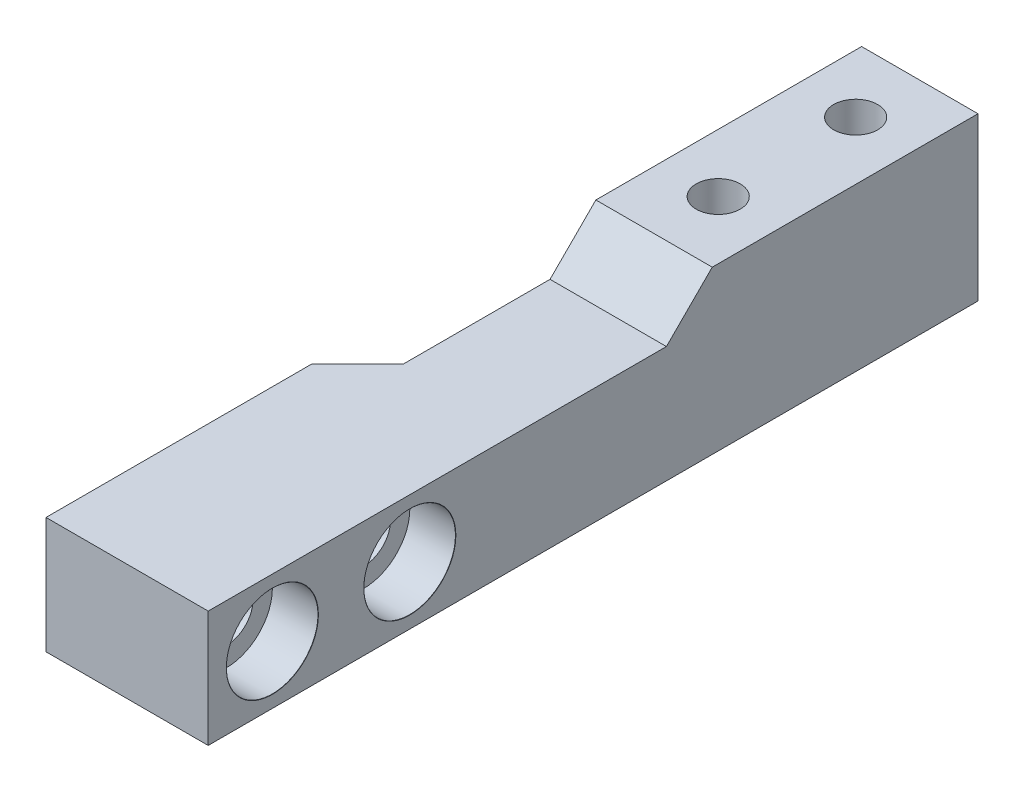
ISO-10303-21;
HEADER;
FILE_DESCRIPTION(('STEP AP214'),'2;1');
FILE_NAME('part.step','',(''),(''),'','','');
FILE_SCHEMA(('AUTOMOTIVE_DESIGN { 1 0 10303 214 1 1 1 1 }'));
ENDSEC;
DATA;
#1=APPLICATION_CONTEXT('core data for automotive mechanical design processes');
#2=APPLICATION_PROTOCOL_DEFINITION('international standard','automotive_design',2000,#1);
#3=PRODUCT_CONTEXT('',#1,'mechanical');
#4=PRODUCT('Part','Part','',(#3));
#5=PRODUCT_RELATED_PRODUCT_CATEGORY('part','',(#4));
#6=PRODUCT_DEFINITION_FORMATION('','',#4);
#7=PRODUCT_DEFINITION_CONTEXT('part definition',#1,'design');
#8=PRODUCT_DEFINITION('design','',#6,#7);
#9=PRODUCT_DEFINITION_SHAPE('','',#8);
#10=(LENGTH_UNIT() NAMED_UNIT(*) SI_UNIT(.MILLI.,.METRE.));
#11=(NAMED_UNIT(*) PLANE_ANGLE_UNIT() SI_UNIT($,.RADIAN.));
#12=(NAMED_UNIT(*) SI_UNIT($,.STERADIAN.) SOLID_ANGLE_UNIT());
#13=UNCERTAINTY_MEASURE_WITH_UNIT(LENGTH_MEASURE(1.E-05),#10,'distance_accuracy_value','');
#14=(GEOMETRIC_REPRESENTATION_CONTEXT(3) GLOBAL_UNCERTAINTY_ASSIGNED_CONTEXT((#13)) GLOBAL_UNIT_ASSIGNED_CONTEXT((#10,
#11,#12)) REPRESENTATION_CONTEXT('',''));
#15=CARTESIAN_POINT('',(0.,0.,0.));
#16=DIRECTION('',(0.,0.,1.));
#17=DIRECTION('',(1.,0.,0.));
#18=AXIS2_PLACEMENT_3D('',#15,#16,#17);
#19=CARTESIAN_POINT('',(-6.35,12.7,42.));
#20=DIRECTION('',(1.,0.,0.));
#21=DIRECTION('',(0.,0.,-1.));
#22=AXIS2_PLACEMENT_3D('',#19,#20,#21);
#23=PLANE('',#22);
#24=DIRECTION('',(0.,0.,1.));
#25=VECTOR('',#24,1.);
#26=CARTESIAN_POINT('',(-6.35,0.,42.));
#27=LINE('',#26,#25);
#28=CARTESIAN_POINT('',(-6.35,0.,-42.));
#29=VERTEX_POINT('',#28);
#30=CARTESIAN_POINT('',(-6.35,0.,8.00000000000004));
#31=VERTEX_POINT('',#30);
#32=EDGE_CURVE('E220',#29,#31,#27,.T.);
#33=ORIENTED_EDGE('',*,*,#32,.T.);
#34=DIRECTION('',(0.,1.,0.));
#35=VECTOR('',#34,1.);
#36=CARTESIAN_POINT('',(-6.35,12.7,8.00000000000004));
#37=LINE('',#36,#35);
#38=CARTESIAN_POINT('',(-6.35,12.7,8.00000000000005));
#39=VERTEX_POINT('',#38);
#40=EDGE_CURVE('E235',#31,#39,#37,.T.);
#41=ORIENTED_EDGE('',*,*,#40,.T.);
#42=DIRECTION('',(0.,0.,1.));
#43=VECTOR('',#42,1.);
#44=CARTESIAN_POINT('',(-6.35,12.7,42.));
#45=LINE('',#44,#43);
#46=CARTESIAN_POINT('',(-6.35,12.7,-7.99999999999999));
#47=VERTEX_POINT('',#46);
#48=EDGE_CURVE('E121',#47,#39,#45,.T.);
#49=ORIENTED_EDGE('',*,*,#48,.F.);
#50=DIRECTION('',(0.,-0.707106781186551,0.707106781186544));
#51=VECTOR('',#50,1.);
#52=CARTESIAN_POINT('',(-6.35,-12.3,16.9999999999997));
#53=LINE('',#52,#51);
#54=CARTESIAN_POINT('',(-6.34999999999994,17.7,-13.));
#55=VERTEX_POINT('',#54);
#56=EDGE_CURVE('E11',#47,#55,#53,.F.);
#57=ORIENTED_EDGE('',*,*,#56,.T.);
#58=DIRECTION('',(0.,0.,1.));
#59=VECTOR('',#58,1.);
#60=CARTESIAN_POINT('',(-6.34999999999994,17.7,-42.));
#61=LINE('',#60,#59);
#62=CARTESIAN_POINT('',(-6.34999999999994,17.7,-42.));
#63=VERTEX_POINT('',#62);
#64=EDGE_CURVE('E191',#63,#55,#61,.T.);
#65=ORIENTED_EDGE('',*,*,#64,.F.);
#66=DIRECTION('',(0.,-1.,0.));
#67=VECTOR('',#66,1.);
#68=CARTESIAN_POINT('',(-6.35,12.7,-42.));
#69=LINE('',#68,#67);
#70=EDGE_CURVE('E227',#63,#29,#69,.T.);
#71=ORIENTED_EDGE('',*,*,#70,.T.);
#72=EDGE_LOOP('',(#33,#41,#49,#57,#65,#71));
#73=FACE_BOUND('',#72,.T.);
#74=ADVANCED_FACE('F45',(#73),#23,.F.);
#75=CARTESIAN_POINT('',(0.,12.7,0.));
#76=DIRECTION('',(0.,-1.,0.));
#77=DIRECTION('',(0.,0.,-1.));
#78=AXIS2_PLACEMENT_3D('',#75,#76,#77);
#79=PLANE('',#78);
#80=DIRECTION('',(0.,0.,-1.));
#81=VECTOR('',#80,1.);
#82=CARTESIAN_POINT('',(6.35,12.7,42.));
#83=LINE('',#82,#81);
#84=CARTESIAN_POINT('',(6.35,12.7,42.));
#85=VERTEX_POINT('',#84);
#86=CARTESIAN_POINT('',(6.35,12.7,-7.99999999999999));
#87=VERTEX_POINT('',#86);
#88=EDGE_CURVE('E208',#85,#87,#83,.T.);
#89=ORIENTED_EDGE('',*,*,#88,.T.);
#90=DIRECTION('',(-1.,0.,0.));
#91=VECTOR('',#90,1.);
#92=CARTESIAN_POINT('',(-6.35,12.7,-8.00000000000001));
#93=LINE('',#92,#91);
#94=EDGE_CURVE('E238',#87,#47,#93,.T.);
#95=ORIENTED_EDGE('',*,*,#94,.T.);
#96=ORIENTED_EDGE('',*,*,#48,.T.);
#97=DIRECTION('',(0.707106781186552,0.,-0.707106781186543));
#98=VECTOR('',#97,1.);
#99=CARTESIAN_POINT('',(0.825000000000056,12.7,0.825000000000066));
#100=LINE('',#99,#98);
#101=CARTESIAN_POINT('',(-11.35,12.7,13.));
#102=VERTEX_POINT('',#101);
#103=EDGE_CURVE('E128',#39,#102,#100,.F.);
#104=ORIENTED_EDGE('',*,*,#103,.T.);
#105=DIRECTION('',(0.,0.,-1.));
#106=VECTOR('',#105,1.);
#107=CARTESIAN_POINT('',(-11.35,12.7,42.));
#108=LINE('',#107,#106);
#109=CARTESIAN_POINT('',(-11.35,12.7,42.));
#110=VERTEX_POINT('',#109);
#111=EDGE_CURVE('E124',#110,#102,#108,.T.);
#112=ORIENTED_EDGE('',*,*,#111,.F.);
#113=DIRECTION('',(1.,0.,0.));
#114=VECTOR('',#113,1.);
#115=CARTESIAN_POINT('',(-6.35,12.7,42.));
#116=LINE('',#115,#114);
#117=EDGE_CURVE('E112',#110,#85,#116,.T.);
#118=ORIENTED_EDGE('',*,*,#117,.T.);
#119=EDGE_LOOP('',(#89,#95,#96,#104,#112,#118));
#120=FACE_BOUND('',#119,.T.);
#121=ADVANCED_FACE('F125',(#120),#79,.F.);
#122=CARTESIAN_POINT('',(6.35,12.7,42.));
#123=DIRECTION('',(-1.,0.,0.));
#124=DIRECTION('',(0.,0.,1.));
#125=AXIS2_PLACEMENT_3D('',#122,#123,#124);
#126=PLANE('',#125);
#127=CARTESIAN_POINT('',(6.35,6.35,35.));
#128=DIRECTION('',(1.,0.,0.));
#129=DIRECTION('',(0.,0.,-1.));
#130=AXIS2_PLACEMENT_3D('',#127,#128,#129);
#131=CIRCLE('',#130,5.025);
#132=CARTESIAN_POINT('',(6.35,6.35,29.975));
#133=VERTEX_POINT('',#132);
#134=EDGE_CURVE('E636',#133,#133,#131,.T.);
#135=ORIENTED_EDGE('',*,*,#134,.F.);
#136=EDGE_LOOP('',(#135));
#137=FACE_BOUND('',#136,.T.);
#138=CARTESIAN_POINT('',(6.35,6.35,20.));
#139=DIRECTION('',(1.,0.,0.));
#140=DIRECTION('',(0.,0.,-1.));
#141=AXIS2_PLACEMENT_3D('',#138,#139,#140);
#142=CIRCLE('',#141,5.025);
#143=CARTESIAN_POINT('',(6.35,6.35,14.975));
#144=VERTEX_POINT('',#143);
#145=EDGE_CURVE('E618',#144,#144,#142,.T.);
#146=ORIENTED_EDGE('',*,*,#145,.F.);
#147=EDGE_LOOP('',(#146));
#148=FACE_BOUND('',#147,.T.);
#149=DIRECTION('',(0.,0.,-1.));
#150=VECTOR('',#149,1.);
#151=CARTESIAN_POINT('',(6.35,0.,42.));
#152=LINE('',#151,#150);
#153=CARTESIAN_POINT('',(6.35,0.,42.));
#154=VERTEX_POINT('',#153);
#155=CARTESIAN_POINT('',(6.35,0.,-42.));
#156=VERTEX_POINT('',#155);
#157=EDGE_CURVE('E207',#154,#156,#152,.T.);
#158=ORIENTED_EDGE('',*,*,#157,.T.);
#159=DIRECTION('',(0.,-1.,0.));
#160=VECTOR('',#159,1.);
#161=CARTESIAN_POINT('',(6.35,12.7,-42.));
#162=LINE('',#161,#160);
#163=CARTESIAN_POINT('',(6.34999999999994,17.7,-42.));
#164=VERTEX_POINT('',#163);
#165=EDGE_CURVE('E231',#164,#156,#162,.T.);
#166=ORIENTED_EDGE('',*,*,#165,.F.);
#167=DIRECTION('',(0.,0.,-1.));
#168=VECTOR('',#167,1.);
#169=CARTESIAN_POINT('',(6.34999999999994,17.7,-42.));
#170=LINE('',#169,#168);
#171=CARTESIAN_POINT('',(6.35000000000006,17.7,-13.));
#172=VERTEX_POINT('',#171);
#173=EDGE_CURVE('E199',#172,#164,#170,.T.);
#174=ORIENTED_EDGE('',*,*,#173,.F.);
#175=DIRECTION('',(0.,0.707106781186551,-0.707106781186544));
#176=VECTOR('',#175,1.);
#177=CARTESIAN_POINT('',(6.35,-12.3,16.9999999999997));
#178=LINE('',#177,#176);
#179=EDGE_CURVE('E55',#172,#87,#178,.F.);
#180=ORIENTED_EDGE('',*,*,#179,.T.);
#181=ORIENTED_EDGE('',*,*,#88,.F.);
#182=DIRECTION('',(0.,-1.,0.));
#183=VECTOR('',#182,1.);
#184=CARTESIAN_POINT('',(6.35,12.7,42.));
#185=LINE('',#184,#183);
#186=EDGE_CURVE('E118',#85,#154,#185,.T.);
#187=ORIENTED_EDGE('',*,*,#186,.T.);
#188=EDGE_LOOP('',(#158,#166,#174,#180,#181,#187));
#189=FACE_BOUND('',#188,.T.);
#190=ADVANCED_FACE('F256',(#137,#148,#189),#126,.F.);
#191=CARTESIAN_POINT('',(-6.35,12.7,-42.));
#192=DIRECTION('',(0.,0.,1.));
#193=DIRECTION('',(1.,0.,0.));
#194=AXIS2_PLACEMENT_3D('',#191,#192,#193);
#195=PLANE('',#194);
#196=DIRECTION('',(-1.,0.,0.));
#197=VECTOR('',#196,1.);
#198=CARTESIAN_POINT('',(-6.35,0.,-42.));
#199=LINE('',#198,#197);
#200=EDGE_CURVE('E217',#156,#29,#199,.T.);
#201=ORIENTED_EDGE('',*,*,#200,.T.);
#202=ORIENTED_EDGE('',*,*,#70,.F.);
#203=DIRECTION('',(-1.,0.,0.));
#204=VECTOR('',#203,1.);
#205=CARTESIAN_POINT('',(-6.34999999999994,17.7,-42.));
#206=LINE('',#205,#204);
#207=EDGE_CURVE('E203',#164,#63,#206,.T.);
#208=ORIENTED_EDGE('',*,*,#207,.F.);
#209=ORIENTED_EDGE('',*,*,#165,.T.);
#210=EDGE_LOOP('',(#201,#202,#208,#209));
#211=FACE_BOUND('',#210,.T.);
#212=ADVANCED_FACE('F259',(#211),#195,.F.);
#213=CARTESIAN_POINT('',(-6.35,12.7,42.));
#214=DIRECTION('',(0.,0.,-1.));
#215=DIRECTION('',(-1.,0.,0.));
#216=AXIS2_PLACEMENT_3D('',#213,#214,#215);
#217=PLANE('',#216);
#218=DIRECTION('',(1.,0.,0.));
#219=VECTOR('',#218,1.);
#220=CARTESIAN_POINT('',(-6.35,0.,42.));
#221=LINE('',#220,#219);
#222=CARTESIAN_POINT('',(-11.35,0.,42.));
#223=VERTEX_POINT('',#222);
#224=EDGE_CURVE('E211',#223,#154,#221,.T.);
#225=ORIENTED_EDGE('',*,*,#224,.T.);
#226=ORIENTED_EDGE('',*,*,#186,.F.);
#227=ORIENTED_EDGE('',*,*,#117,.F.);
#228=DIRECTION('',(0.,1.,0.));
#229=VECTOR('',#228,1.);
#230=CARTESIAN_POINT('',(-11.35,12.7,42.));
#231=LINE('',#230,#229);
#232=EDGE_CURVE('E116',#223,#110,#231,.T.);
#233=ORIENTED_EDGE('',*,*,#232,.F.);
#234=EDGE_LOOP('',(#225,#226,#227,#233));
#235=FACE_BOUND('',#234,.T.);
#236=ADVANCED_FACE('F114',(#235),#217,.F.);
#237=CARTESIAN_POINT('',(0.,0.,0.));
#238=DIRECTION('',(0.,-1.,0.));
#239=DIRECTION('',(0.,0.,-1.));
#240=AXIS2_PLACEMENT_3D('',#237,#238,#239);
#241=PLANE('',#240);
#242=CARTESIAN_POINT('',(0.,0.,-35.));
#243=DIRECTION('',(0.,-1.,0.));
#244=DIRECTION('',(0.,0.,-1.));
#245=AXIS2_PLACEMENT_3D('',#242,#243,#244);
#246=CIRCLE('',#245,4.025);
#247=CARTESIAN_POINT('',(0.,0.,-39.025));
#248=VERTEX_POINT('',#247);
#249=EDGE_CURVE('E151',#248,#248,#246,.T.);
#250=ORIENTED_EDGE('',*,*,#249,.F.);
#251=EDGE_LOOP('',(#250));
#252=FACE_BOUND('',#251,.T.);
#253=CARTESIAN_POINT('',(0.,0.,-20.));
#254=DIRECTION('',(0.,-1.,0.));
#255=DIRECTION('',(0.,0.,-1.));
#256=AXIS2_PLACEMENT_3D('',#253,#254,#255);
#257=CIRCLE('',#256,4.025);
#258=CARTESIAN_POINT('',(0.,0.,-24.025));
#259=VERTEX_POINT('',#258);
#260=EDGE_CURVE('E171',#259,#259,#257,.T.);
#261=ORIENTED_EDGE('',*,*,#260,.F.);
#262=EDGE_LOOP('',(#261));
#263=FACE_BOUND('',#262,.T.);
#264=ORIENTED_EDGE('',*,*,#157,.F.);
#265=ORIENTED_EDGE('',*,*,#224,.F.);
#266=DIRECTION('',(0.,0.,1.));
#267=VECTOR('',#266,1.);
#268=CARTESIAN_POINT('',(-11.35,0.,42.));
#269=LINE('',#268,#267);
#270=CARTESIAN_POINT('',(-11.35,0.,13.));
#271=VERTEX_POINT('',#270);
#272=EDGE_CURVE('E137',#271,#223,#269,.T.);
#273=ORIENTED_EDGE('',*,*,#272,.F.);
#274=DIRECTION('',(-0.707106781186552,0.,0.707106781186543));
#275=VECTOR('',#274,1.);
#276=CARTESIAN_POINT('',(-11.35,0.,13.));
#277=LINE('',#276,#275);
#278=EDGE_CURVE('E69',#271,#31,#277,.F.);
#279=ORIENTED_EDGE('',*,*,#278,.T.);
#280=ORIENTED_EDGE('',*,*,#32,.F.);
#281=ORIENTED_EDGE('',*,*,#200,.F.);
#282=EDGE_LOOP('',(#264,#265,#273,#279,#280,#281));
#283=FACE_BOUND('',#282,.T.);
#284=ADVANCED_FACE('F260',(#252,#263,#283),#241,.T.);
#285=CARTESIAN_POINT('',(0.,17.7,0.));
#286=DIRECTION('',(0.,1.,0.));
#287=DIRECTION('',(0.,0.,1.));
#288=AXIS2_PLACEMENT_3D('',#285,#286,#287);
#289=PLANE('',#288);
#290=CARTESIAN_POINT('',(0.,17.7,-35.));
#291=DIRECTION('',(0.,-1.,0.));
#292=DIRECTION('',(0.,0.,-1.));
#293=AXIS2_PLACEMENT_3D('',#290,#291,#292);
#294=CIRCLE('',#293,2.4);
#295=CARTESIAN_POINT('',(0.,17.7,-37.4));
#296=VERTEX_POINT('',#295);
#297=EDGE_CURVE('E167',#296,#296,#294,.T.);
#298=ORIENTED_EDGE('',*,*,#297,.T.);
#299=EDGE_LOOP('',(#298));
#300=FACE_BOUND('',#299,.T.);
#301=CARTESIAN_POINT('',(0.,17.7,-20.));
#302=DIRECTION('',(0.,-1.,0.));
#303=DIRECTION('',(0.,0.,-1.));
#304=AXIS2_PLACEMENT_3D('',#301,#302,#303);
#305=CIRCLE('',#304,2.4);
#306=CARTESIAN_POINT('',(0.,17.7,-22.4));
#307=VERTEX_POINT('',#306);
#308=EDGE_CURVE('E187',#307,#307,#305,.T.);
#309=ORIENTED_EDGE('',*,*,#308,.T.);
#310=EDGE_LOOP('',(#309));
#311=FACE_BOUND('',#310,.T.);
#312=ORIENTED_EDGE('',*,*,#64,.T.);
#313=DIRECTION('',(1.,0.,0.));
#314=VECTOR('',#313,1.);
#315=CARTESIAN_POINT('',(-6.34999999999994,17.7,-13.));
#316=LINE('',#315,#314);
#317=EDGE_CURVE('E195',#55,#172,#316,.T.);
#318=ORIENTED_EDGE('',*,*,#317,.T.);
#319=ORIENTED_EDGE('',*,*,#173,.T.);
#320=ORIENTED_EDGE('',*,*,#207,.T.);
#321=EDGE_LOOP('',(#312,#318,#319,#320));
#322=FACE_BOUND('',#321,.T.);
#323=ADVANCED_FACE('F254',(#300,#311,#322),#289,.T.);
#324=CARTESIAN_POINT('',(0.,0.,-20.));
#325=DIRECTION('',(0.,-1.,0.));
#326=DIRECTION('',(0.,0.,-1.));
#327=AXIS2_PLACEMENT_3D('',#324,#325,#326);
#328=CYLINDRICAL_SURFACE('',#327,2.4);
#329=ORIENTED_EDGE('',*,*,#308,.F.);
#330=EDGE_LOOP('',(#329));
#331=FACE_BOUND('',#330,.T.);
#332=CARTESIAN_POINT('',(0.,4.,-20.));
#333=DIRECTION('',(0.,-1.,0.));
#334=DIRECTION('',(0.,0.,-1.));
#335=AXIS2_PLACEMENT_3D('',#332,#333,#334);
#336=CIRCLE('',#335,2.4);
#337=CARTESIAN_POINT('',(0.,4.,-22.4));
#338=VERTEX_POINT('',#337);
#339=EDGE_CURVE('E183',#338,#338,#336,.T.);
#340=ORIENTED_EDGE('',*,*,#339,.T.);
#341=EDGE_LOOP('',(#340));
#342=FACE_BOUND('',#341,.T.);
#343=ADVANCED_FACE('F268',(#331,#342),#328,.F.);
#344=CARTESIAN_POINT('',(4.,4.,-20.));
#345=DIRECTION('',(0.,1.,0.));
#346=DIRECTION('',(0.,0.,1.));
#347=AXIS2_PLACEMENT_3D('',#344,#345,#346);
#348=PLANE('',#347);
#349=ORIENTED_EDGE('',*,*,#339,.F.);
#350=EDGE_LOOP('',(#349));
#351=FACE_BOUND('',#350,.T.);
#352=CARTESIAN_POINT('',(0.,4.,-20.));
#353=DIRECTION('',(0.,-1.,0.));
#354=DIRECTION('',(0.,0.,-1.));
#355=AXIS2_PLACEMENT_3D('',#352,#353,#354);
#356=CIRCLE('',#355,4.);
#357=CARTESIAN_POINT('',(0.,4.,-24.));
#358=VERTEX_POINT('',#357);
#359=EDGE_CURVE('E179',#358,#358,#356,.T.);
#360=ORIENTED_EDGE('',*,*,#359,.T.);
#361=EDGE_LOOP('',(#360));
#362=FACE_BOUND('',#361,.T.);
#363=ADVANCED_FACE('F357',(#351,#362),#348,.F.);
#364=CARTESIAN_POINT('',(0.,0.,-20.));
#365=DIRECTION('',(0.,-1.,0.));
#366=DIRECTION('',(0.,0.,-1.));
#367=AXIS2_PLACEMENT_3D('',#364,#365,#366);
#368=CYLINDRICAL_SURFACE('',#367,4.);
#369=ORIENTED_EDGE('',*,*,#359,.F.);
#370=EDGE_LOOP('',(#369));
#371=FACE_BOUND('',#370,.T.);
#372=CARTESIAN_POINT('',(0.,0.020977490779434,-20.));
#373=DIRECTION('',(0.,-1.,0.));
#374=DIRECTION('',(0.,0.,-1.));
#375=AXIS2_PLACEMENT_3D('',#372,#373,#374);
#376=CIRCLE('',#375,4.);
#377=CARTESIAN_POINT('',(0.,0.020977490779434,-24.));
#378=VERTEX_POINT('',#377);
#379=EDGE_CURVE('E175',#378,#378,#376,.T.);
#380=ORIENTED_EDGE('',*,*,#379,.T.);
#381=EDGE_LOOP('',(#380));
#382=FACE_BOUND('',#381,.T.);
#383=ADVANCED_FACE('F353',(#371,#382),#368,.F.);
#384=CARTESIAN_POINT('',(0.,0.,-20.));
#385=DIRECTION('',(0.,-1.,0.));
#386=DIRECTION('',(0.,0.,-1.));
#387=AXIS2_PLACEMENT_3D('',#384,#385,#386);
#388=CONICAL_SURFACE('',#387,4.025,0.872664625997167);
#389=ORIENTED_EDGE('',*,*,#379,.F.);
#390=EDGE_LOOP('',(#389));
#391=FACE_BOUND('',#390,.T.);
#392=ORIENTED_EDGE('',*,*,#260,.T.);
#393=EDGE_LOOP('',(#392));
#394=FACE_BOUND('',#393,.T.);
#395=ADVANCED_FACE('F349',(#391,#394),#388,.F.);
#396=CARTESIAN_POINT('',(0.,0.,-35.));
#397=DIRECTION('',(0.,-1.,0.));
#398=DIRECTION('',(0.,0.,-1.));
#399=AXIS2_PLACEMENT_3D('',#396,#397,#398);
#400=CYLINDRICAL_SURFACE('',#399,2.4);
#401=ORIENTED_EDGE('',*,*,#297,.F.);
#402=EDGE_LOOP('',(#401));
#403=FACE_BOUND('',#402,.T.);
#404=CARTESIAN_POINT('',(0.,4.,-35.));
#405=DIRECTION('',(0.,-1.,0.));
#406=DIRECTION('',(0.,0.,-1.));
#407=AXIS2_PLACEMENT_3D('',#404,#405,#406);
#408=CIRCLE('',#407,2.4);
#409=CARTESIAN_POINT('',(0.,4.,-37.4));
#410=VERTEX_POINT('',#409);
#411=EDGE_CURVE('E163',#410,#410,#408,.T.);
#412=ORIENTED_EDGE('',*,*,#411,.T.);
#413=EDGE_LOOP('',(#412));
#414=FACE_BOUND('',#413,.T.);
#415=ADVANCED_FACE('F345',(#403,#414),#400,.F.);
#416=CARTESIAN_POINT('',(4.,4.,-35.));
#417=DIRECTION('',(0.,1.,0.));
#418=DIRECTION('',(0.,0.,1.));
#419=AXIS2_PLACEMENT_3D('',#416,#417,#418);
#420=PLANE('',#419);
#421=ORIENTED_EDGE('',*,*,#411,.F.);
#422=EDGE_LOOP('',(#421));
#423=FACE_BOUND('',#422,.T.);
#424=CARTESIAN_POINT('',(0.,4.,-35.));
#425=DIRECTION('',(0.,-1.,0.));
#426=DIRECTION('',(0.,0.,-1.));
#427=AXIS2_PLACEMENT_3D('',#424,#425,#426);
#428=CIRCLE('',#427,4.);
#429=CARTESIAN_POINT('',(0.,4.,-39.));
#430=VERTEX_POINT('',#429);
#431=EDGE_CURVE('E159',#430,#430,#428,.T.);
#432=ORIENTED_EDGE('',*,*,#431,.T.);
#433=EDGE_LOOP('',(#432));
#434=FACE_BOUND('',#433,.T.);
#435=ADVANCED_FACE('F341',(#423,#434),#420,.F.);
#436=CARTESIAN_POINT('',(0.,0.,-35.));
#437=DIRECTION('',(0.,-1.,0.));
#438=DIRECTION('',(0.,0.,-1.));
#439=AXIS2_PLACEMENT_3D('',#436,#437,#438);
#440=CYLINDRICAL_SURFACE('',#439,4.);
#441=ORIENTED_EDGE('',*,*,#431,.F.);
#442=EDGE_LOOP('',(#441));
#443=FACE_BOUND('',#442,.T.);
#444=CARTESIAN_POINT('',(0.,0.020977490779434,-35.));
#445=DIRECTION('',(0.,-1.,0.));
#446=DIRECTION('',(0.,0.,-1.));
#447=AXIS2_PLACEMENT_3D('',#444,#445,#446);
#448=CIRCLE('',#447,4.);
#449=CARTESIAN_POINT('',(0.,0.020977490779434,-39.));
#450=VERTEX_POINT('',#449);
#451=EDGE_CURVE('E155',#450,#450,#448,.T.);
#452=ORIENTED_EDGE('',*,*,#451,.T.);
#453=EDGE_LOOP('',(#452));
#454=FACE_BOUND('',#453,.T.);
#455=ADVANCED_FACE('F337',(#443,#454),#440,.F.);
#456=CARTESIAN_POINT('',(0.,0.,-35.));
#457=DIRECTION('',(0.,-1.,0.));
#458=DIRECTION('',(0.,0.,-1.));
#459=AXIS2_PLACEMENT_3D('',#456,#457,#458);
#460=CONICAL_SURFACE('',#459,4.025,0.872664625997167);
#461=ORIENTED_EDGE('',*,*,#451,.F.);
#462=EDGE_LOOP('',(#461));
#463=FACE_BOUND('',#462,.T.);
#464=ORIENTED_EDGE('',*,*,#249,.T.);
#465=EDGE_LOOP('',(#464));
#466=FACE_BOUND('',#465,.T.);
#467=ADVANCED_FACE('F333',(#463,#466),#460,.F.);
#468=CARTESIAN_POINT('',(-11.35,0.,0.));
#469=DIRECTION('',(1.,0.,0.));
#470=DIRECTION('',(0.,0.,-1.));
#471=AXIS2_PLACEMENT_3D('',#468,#469,#470);
#472=PLANE('',#471);
#473=CARTESIAN_POINT('',(-11.35,6.35,35.));
#474=DIRECTION('',(1.,0.,0.));
#475=DIRECTION('',(0.,0.,-1.));
#476=AXIS2_PLACEMENT_3D('',#473,#474,#475);
#477=CIRCLE('',#476,2.89999999999999);
#478=CARTESIAN_POINT('',(-11.35,6.35,32.1));
#479=VERTEX_POINT('',#478);
#480=EDGE_CURVE('E603',#479,#479,#477,.T.);
#481=ORIENTED_EDGE('',*,*,#480,.T.);
#482=EDGE_LOOP('',(#481));
#483=FACE_BOUND('',#482,.T.);
#484=CARTESIAN_POINT('',(-11.35,6.35,20.));
#485=DIRECTION('',(1.,0.,0.));
#486=DIRECTION('',(0.,0.,-1.));
#487=AXIS2_PLACEMENT_3D('',#484,#485,#486);
#488=CIRCLE('',#487,2.89999999999999);
#489=CARTESIAN_POINT('',(-11.35,6.35,17.1));
#490=VERTEX_POINT('',#489);
#491=EDGE_CURVE('E139',#490,#490,#488,.T.);
#492=ORIENTED_EDGE('',*,*,#491,.T.);
#493=EDGE_LOOP('',(#492));
#494=FACE_BOUND('',#493,.T.);
#495=ORIENTED_EDGE('',*,*,#232,.T.);
#496=ORIENTED_EDGE('',*,*,#111,.T.);
#497=DIRECTION('',(0.,-1.,0.));
#498=VECTOR('',#497,1.);
#499=CARTESIAN_POINT('',(-11.35,12.7,13.));
#500=LINE('',#499,#498);
#501=EDGE_CURVE('E133',#102,#271,#500,.T.);
#502=ORIENTED_EDGE('',*,*,#501,.T.);
#503=ORIENTED_EDGE('',*,*,#272,.T.);
#504=EDGE_LOOP('',(#495,#496,#502,#503));
#505=FACE_BOUND('',#504,.T.);
#506=ADVANCED_FACE('F136',(#483,#494,#505),#472,.F.);
#507=CARTESIAN_POINT('',(6.35,6.35,20.));
#508=DIRECTION('',(1.,0.,0.));
#509=DIRECTION('',(0.,0.,-1.));
#510=AXIS2_PLACEMENT_3D('',#507,#508,#509);
#511=CYLINDRICAL_SURFACE('',#510,2.9);
#512=ORIENTED_EDGE('',*,*,#491,.F.);
#513=EDGE_LOOP('',(#512));
#514=FACE_BOUND('',#513,.T.);
#515=CARTESIAN_POINT('',(1.35,6.35,20.));
#516=DIRECTION('',(1.,0.,0.));
#517=DIRECTION('',(0.,0.,-1.));
#518=AXIS2_PLACEMENT_3D('',#515,#516,#517);
#519=CIRCLE('',#518,2.9);
#520=CARTESIAN_POINT('',(1.35,6.35,17.1));
#521=VERTEX_POINT('',#520);
#522=EDGE_CURVE('E143',#521,#521,#519,.T.);
#523=ORIENTED_EDGE('',*,*,#522,.T.);
#524=EDGE_LOOP('',(#523));
#525=FACE_BOUND('',#524,.T.);
#526=ADVANCED_FACE('F326',(#514,#525),#511,.F.);
#527=CARTESIAN_POINT('',(1.35,11.35,20.));
#528=DIRECTION('',(-1.,0.,0.));
#529=DIRECTION('',(0.,0.,1.));
#530=AXIS2_PLACEMENT_3D('',#527,#528,#529);
#531=PLANE('',#530);
#532=ORIENTED_EDGE('',*,*,#522,.F.);
#533=EDGE_LOOP('',(#532));
#534=FACE_BOUND('',#533,.T.);
#535=CARTESIAN_POINT('',(1.35,6.35,20.));
#536=DIRECTION('',(1.,0.,0.));
#537=DIRECTION('',(0.,0.,-1.));
#538=AXIS2_PLACEMENT_3D('',#535,#536,#537);
#539=CIRCLE('',#538,5.);
#540=CARTESIAN_POINT('',(1.35,6.35,15.));
#541=VERTEX_POINT('',#540);
#542=EDGE_CURVE('E609',#541,#541,#539,.T.);
#543=ORIENTED_EDGE('',*,*,#542,.T.);
#544=EDGE_LOOP('',(#543));
#545=FACE_BOUND('',#544,.T.);
#546=ADVANCED_FACE('F322',(#534,#545),#531,.F.);
#547=CARTESIAN_POINT('',(6.35,6.35,20.));
#548=DIRECTION('',(1.,0.,0.));
#549=DIRECTION('',(0.,0.,-1.));
#550=AXIS2_PLACEMENT_3D('',#547,#548,#549);
#551=CYLINDRICAL_SURFACE('',#550,5.);
#552=ORIENTED_EDGE('',*,*,#542,.F.);
#553=EDGE_LOOP('',(#552));
#554=FACE_BOUND('',#553,.T.);
#555=CARTESIAN_POINT('',(6.32902250922057,6.35,20.));
#556=DIRECTION('',(1.,0.,0.));
#557=DIRECTION('',(0.,0.,-1.));
#558=AXIS2_PLACEMENT_3D('',#555,#556,#557);
#559=CIRCLE('',#558,5.);
#560=CARTESIAN_POINT('',(6.32902250922057,6.35,15.));
#561=VERTEX_POINT('',#560);
#562=EDGE_CURVE('E612',#561,#561,#559,.T.);
#563=ORIENTED_EDGE('',*,*,#562,.T.);
#564=EDGE_LOOP('',(#563));
#565=FACE_BOUND('',#564,.T.);
#566=ADVANCED_FACE('F318',(#554,#565),#551,.F.);
#567=CARTESIAN_POINT('',(6.35,6.35,20.));
#568=DIRECTION('',(1.,0.,0.));
#569=DIRECTION('',(0.,0.,-1.));
#570=AXIS2_PLACEMENT_3D('',#567,#568,#569);
#571=CONICAL_SURFACE('',#570,5.025,0.872664625997138);
#572=ORIENTED_EDGE('',*,*,#562,.F.);
#573=EDGE_LOOP('',(#572));
#574=FACE_BOUND('',#573,.T.);
#575=ORIENTED_EDGE('',*,*,#145,.T.);
#576=EDGE_LOOP('',(#575));
#577=FACE_BOUND('',#576,.T.);
#578=ADVANCED_FACE('F314',(#574,#577),#571,.F.);
#579=CARTESIAN_POINT('',(6.35,6.35,35.));
#580=DIRECTION('',(1.,0.,0.));
#581=DIRECTION('',(0.,0.,-1.));
#582=AXIS2_PLACEMENT_3D('',#579,#580,#581);
#583=CYLINDRICAL_SURFACE('',#582,2.9);
#584=ORIENTED_EDGE('',*,*,#480,.F.);
#585=EDGE_LOOP('',(#584));
#586=FACE_BOUND('',#585,.T.);
#587=CARTESIAN_POINT('',(1.35,6.35,35.));
#588=DIRECTION('',(1.,0.,0.));
#589=DIRECTION('',(0.,0.,-1.));
#590=AXIS2_PLACEMENT_3D('',#587,#588,#589);
#591=CIRCLE('',#590,2.9);
#592=CARTESIAN_POINT('',(1.35,6.35,32.1));
#593=VERTEX_POINT('',#592);
#594=EDGE_CURVE('E624',#593,#593,#591,.T.);
#595=ORIENTED_EDGE('',*,*,#594,.T.);
#596=EDGE_LOOP('',(#595));
#597=FACE_BOUND('',#596,.T.);
#598=ADVANCED_FACE('F310',(#586,#597),#583,.F.);
#599=CARTESIAN_POINT('',(1.35,11.35,35.));
#600=DIRECTION('',(-1.,0.,0.));
#601=DIRECTION('',(0.,0.,1.));
#602=AXIS2_PLACEMENT_3D('',#599,#600,#601);
#603=PLANE('',#602);
#604=ORIENTED_EDGE('',*,*,#594,.F.);
#605=EDGE_LOOP('',(#604));
#606=FACE_BOUND('',#605,.T.);
#607=CARTESIAN_POINT('',(1.35,6.35,35.));
#608=DIRECTION('',(1.,0.,0.));
#609=DIRECTION('',(0.,0.,-1.));
#610=AXIS2_PLACEMENT_3D('',#607,#608,#609);
#611=CIRCLE('',#610,5.);
#612=CARTESIAN_POINT('',(1.35,6.35,30.));
#613=VERTEX_POINT('',#612);
#614=EDGE_CURVE('E628',#613,#613,#611,.T.);
#615=ORIENTED_EDGE('',*,*,#614,.T.);
#616=EDGE_LOOP('',(#615));
#617=FACE_BOUND('',#616,.T.);
#618=ADVANCED_FACE('F302',(#606,#617),#603,.F.);
#619=CARTESIAN_POINT('',(6.35,6.35,35.));
#620=DIRECTION('',(1.,0.,0.));
#621=DIRECTION('',(0.,0.,-1.));
#622=AXIS2_PLACEMENT_3D('',#619,#620,#621);
#623=CYLINDRICAL_SURFACE('',#622,5.);
#624=ORIENTED_EDGE('',*,*,#614,.F.);
#625=EDGE_LOOP('',(#624));
#626=FACE_BOUND('',#625,.T.);
#627=CARTESIAN_POINT('',(6.32902250922057,6.35,35.));
#628=DIRECTION('',(1.,0.,0.));
#629=DIRECTION('',(0.,0.,-1.));
#630=AXIS2_PLACEMENT_3D('',#627,#628,#629);
#631=CIRCLE('',#630,5.);
#632=CARTESIAN_POINT('',(6.32902250922057,6.35,30.));
#633=VERTEX_POINT('',#632);
#634=EDGE_CURVE('E632',#633,#633,#631,.T.);
#635=ORIENTED_EDGE('',*,*,#634,.T.);
#636=EDGE_LOOP('',(#635));
#637=FACE_BOUND('',#636,.T.);
#638=ADVANCED_FACE('F296',(#626,#637),#623,.F.);
#639=CARTESIAN_POINT('',(6.35,6.35,35.));
#640=DIRECTION('',(1.,0.,0.));
#641=DIRECTION('',(0.,0.,-1.));
#642=AXIS2_PLACEMENT_3D('',#639,#640,#641);
#643=CONICAL_SURFACE('',#642,5.025,0.872664625997138);
#644=ORIENTED_EDGE('',*,*,#634,.F.);
#645=EDGE_LOOP('',(#644));
#646=FACE_BOUND('',#645,.T.);
#647=ORIENTED_EDGE('',*,*,#134,.T.);
#648=EDGE_LOOP('',(#647));
#649=FACE_BOUND('',#648,.T.);
#650=ADVANCED_FACE('F290',(#646,#649),#643,.F.);
#651=CARTESIAN_POINT('',(-11.35,12.7,13.));
#652=DIRECTION('',(-0.707106781186543,0.,-0.707106781186552));
#653=DIRECTION('',(0.,1.,0.));
#654=AXIS2_PLACEMENT_3D('',#651,#652,#653);
#655=PLANE('',#654);
#656=ORIENTED_EDGE('',*,*,#103,.F.);
#657=ORIENTED_EDGE('',*,*,#40,.F.);
#658=ORIENTED_EDGE('',*,*,#278,.F.);
#659=ORIENTED_EDGE('',*,*,#501,.F.);
#660=EDGE_LOOP('',(#656,#657,#658,#659));
#661=FACE_BOUND('',#660,.T.);
#662=ADVANCED_FACE('F286',(#661),#655,.T.);
#663=CARTESIAN_POINT('',(-6.34999999999994,17.7,-13.));
#664=DIRECTION('',(0.,0.707106781186544,0.707106781186552));
#665=DIRECTION('',(-1.,0.,0.));
#666=AXIS2_PLACEMENT_3D('',#663,#664,#665);
#667=PLANE('',#666);
#668=ORIENTED_EDGE('',*,*,#56,.F.);
#669=ORIENTED_EDGE('',*,*,#94,.F.);
#670=ORIENTED_EDGE('',*,*,#179,.F.);
#671=ORIENTED_EDGE('',*,*,#317,.F.);
#672=EDGE_LOOP('',(#668,#669,#670,#671));
#673=FACE_BOUND('',#672,.T.);
#674=ADVANCED_FACE('F48',(#673),#667,.T.);
#675=CLOSED_SHELL('',(#74,#121,#190,#212,#236,#284,#323,#343,#363,#383,#395,#415,#435,#455,#467,
#506,#526,#546,#566,#578,#598,#618,#638,#650,#662,#674));
#676=MANIFOLD_SOLID_BREP('B2',#675);
#677=ADVANCED_BREP_SHAPE_REPRESENTATION('',(#18,#676),#14);
#678=SHAPE_DEFINITION_REPRESENTATION(#9,#677);
ENDSEC;
END-ISO-10303-21;
